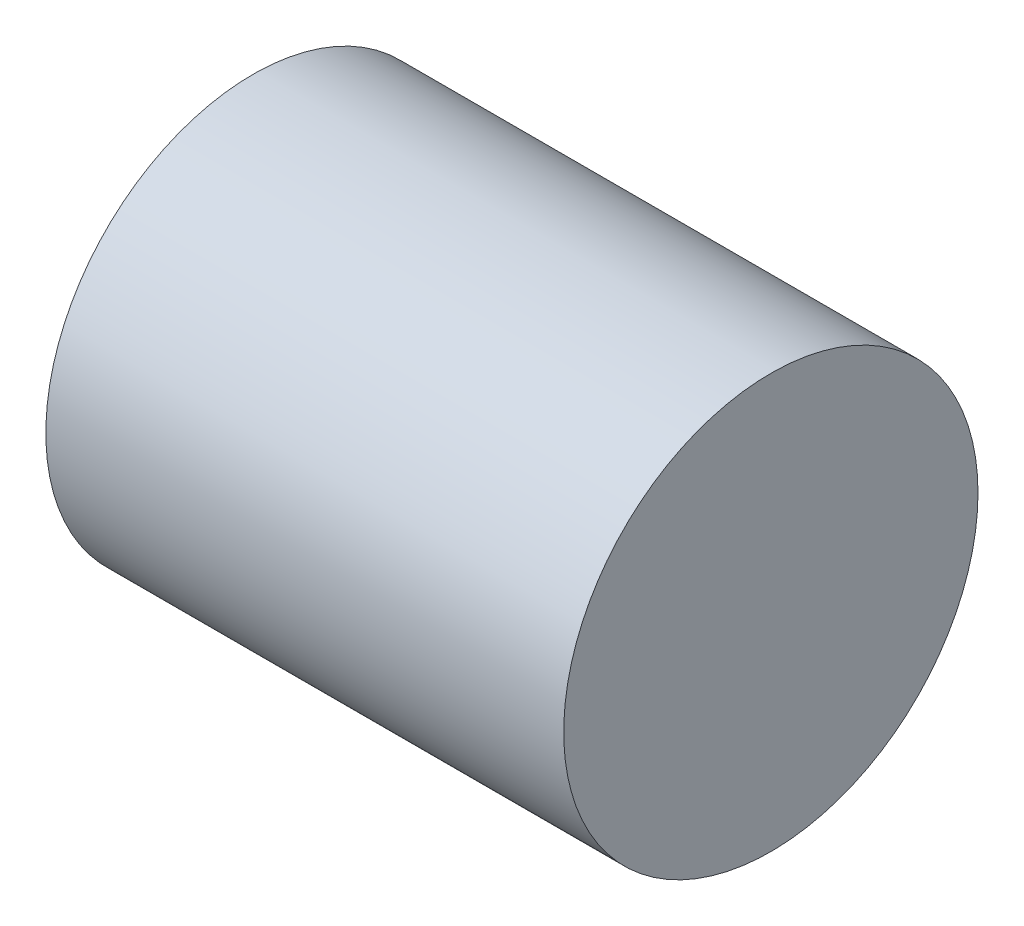
ISO-10303-21;
HEADER;
FILE_DESCRIPTION(('STEP AP214'),'2;1');
FILE_NAME('part.step','',(''),(''),'','','');
FILE_SCHEMA(('AUTOMOTIVE_DESIGN { 1 0 10303 214 1 1 1 1 }'));
ENDSEC;
DATA;
#1=APPLICATION_CONTEXT('core data for automotive mechanical design processes');
#2=APPLICATION_PROTOCOL_DEFINITION('international standard','automotive_design',2000,#1);
#3=PRODUCT_CONTEXT('',#1,'mechanical');
#4=PRODUCT('Part','Part','',(#3));
#5=PRODUCT_RELATED_PRODUCT_CATEGORY('part','',(#4));
#6=PRODUCT_DEFINITION_FORMATION('','',#4);
#7=PRODUCT_DEFINITION_CONTEXT('part definition',#1,'design');
#8=PRODUCT_DEFINITION('design','',#6,#7);
#9=PRODUCT_DEFINITION_SHAPE('','',#8);
#10=(LENGTH_UNIT() NAMED_UNIT(*) SI_UNIT(.MILLI.,.METRE.));
#11=(NAMED_UNIT(*) PLANE_ANGLE_UNIT() SI_UNIT($,.RADIAN.));
#12=(NAMED_UNIT(*) SI_UNIT($,.STERADIAN.) SOLID_ANGLE_UNIT());
#13=UNCERTAINTY_MEASURE_WITH_UNIT(LENGTH_MEASURE(1.E-05),#10,'distance_accuracy_value','');
#14=(GEOMETRIC_REPRESENTATION_CONTEXT(3) GLOBAL_UNCERTAINTY_ASSIGNED_CONTEXT((#13)) GLOBAL_UNIT_ASSIGNED_CONTEXT((#10,
#11,#12)) REPRESENTATION_CONTEXT('',''));
#15=CARTESIAN_POINT('',(0.,0.,0.));
#16=DIRECTION('',(0.,0.,1.));
#17=DIRECTION('',(1.,0.,0.));
#18=AXIS2_PLACEMENT_3D('',#15,#16,#17);
#19=CARTESIAN_POINT('',(10.,0.,0.));
#20=DIRECTION('',(-1.,0.,0.));
#21=DIRECTION('',(0.,0.,1.));
#22=AXIS2_PLACEMENT_3D('',#19,#20,#21);
#23=CYLINDRICAL_SURFACE('',#22,4.);
#24=CARTESIAN_POINT('',(10.,0.,0.));
#25=DIRECTION('',(1.,0.,0.));
#26=DIRECTION('',(0.,0.,-1.));
#27=AXIS2_PLACEMENT_3D('',#24,#25,#26);
#28=CIRCLE('',#27,4.);
#29=CARTESIAN_POINT('',(10.,0.,-4.));
#30=VERTEX_POINT('',#29);
#31=EDGE_CURVE('E10',#30,#30,#28,.T.);
#32=ORIENTED_EDGE('',*,*,#31,.F.);
#33=EDGE_LOOP('',(#32));
#34=FACE_BOUND('',#33,.T.);
#35=CARTESIAN_POINT('',(0.,0.,0.));
#36=DIRECTION('',(1.,0.,0.));
#37=DIRECTION('',(0.,0.,-1.));
#38=AXIS2_PLACEMENT_3D('',#35,#36,#37);
#39=CIRCLE('',#38,4.);
#40=CARTESIAN_POINT('',(0.,0.,-4.));
#41=VERTEX_POINT('',#40);
#42=EDGE_CURVE('E46',#41,#41,#39,.T.);
#43=ORIENTED_EDGE('',*,*,#42,.T.);
#44=EDGE_LOOP('',(#43));
#45=FACE_BOUND('',#44,.T.);
#46=ADVANCED_FACE('F43',(#34,#45),#23,.T.);
#47=CARTESIAN_POINT('',(10.,0.,0.));
#48=DIRECTION('',(1.,0.,0.));
#49=DIRECTION('',(0.,0.,-1.));
#50=AXIS2_PLACEMENT_3D('',#47,#48,#49);
#51=PLANE('',#50);
#52=ORIENTED_EDGE('',*,*,#31,.T.);
#53=EDGE_LOOP('',(#52));
#54=FACE_BOUND('',#53,.T.);
#55=ADVANCED_FACE('F76',(#54),#51,.T.);
#56=CARTESIAN_POINT('',(0.,0.,0.));
#57=DIRECTION('',(1.,0.,0.));
#58=DIRECTION('',(0.,0.,-1.));
#59=AXIS2_PLACEMENT_3D('',#56,#57,#58);
#60=PLANE('',#59);
#61=CARTESIAN_POINT('',(0.,0.,0.));
#62=DIRECTION('',(-1.,0.,0.));
#63=DIRECTION('',(0.,0.,1.));
#64=AXIS2_PLACEMENT_3D('',#61,#62,#63);
#65=CIRCLE('',#64,1.5);
#66=CARTESIAN_POINT('',(0.,0.,1.5));
#67=VERTEX_POINT('',#66);
#68=EDGE_CURVE('E57',#67,#67,#65,.T.);
#69=ORIENTED_EDGE('',*,*,#68,.F.);
#70=EDGE_LOOP('',(#69));
#71=FACE_BOUND('',#70,.T.);
#72=ORIENTED_EDGE('',*,*,#42,.F.);
#73=EDGE_LOOP('',(#72));
#74=FACE_BOUND('',#73,.T.);
#75=ADVANCED_FACE('F70',(#71,#74),#60,.F.);
#76=CARTESIAN_POINT('',(5.,0.,0.));
#77=DIRECTION('',(-1.,0.,0.));
#78=DIRECTION('',(0.,0.,1.));
#79=AXIS2_PLACEMENT_3D('',#76,#77,#78);
#80=CYLINDRICAL_SURFACE('',#79,1.5);
#81=CARTESIAN_POINT('',(5.,0.,0.));
#82=DIRECTION('',(-1.,0.,0.));
#83=DIRECTION('',(0.,0.,1.));
#84=AXIS2_PLACEMENT_3D('',#81,#82,#83);
#85=CIRCLE('',#84,1.5);
#86=CARTESIAN_POINT('',(5.,0.,1.5));
#87=VERTEX_POINT('',#86);
#88=EDGE_CURVE('E55',#87,#87,#85,.T.);
#89=ORIENTED_EDGE('',*,*,#88,.F.);
#90=EDGE_LOOP('',(#89));
#91=FACE_BOUND('',#90,.T.);
#92=ORIENTED_EDGE('',*,*,#68,.T.);
#93=EDGE_LOOP('',(#92));
#94=FACE_BOUND('',#93,.T.);
#95=ADVANCED_FACE('F67',(#91,#94),#80,.F.);
#96=CARTESIAN_POINT('',(5.,0.,0.));
#97=DIRECTION('',(-1.,0.,0.));
#98=DIRECTION('',(0.,0.,1.));
#99=AXIS2_PLACEMENT_3D('',#96,#97,#98);
#100=PLANE('',#99);
#101=ORIENTED_EDGE('',*,*,#88,.T.);
#102=EDGE_LOOP('',(#101));
#103=FACE_BOUND('',#102,.T.);
#104=ADVANCED_FACE('F65',(#103),#100,.T.);
#105=CLOSED_SHELL('',(#46,#55,#75,#95,#104));
#106=MANIFOLD_SOLID_BREP('B2',#105);
#107=ADVANCED_BREP_SHAPE_REPRESENTATION('',(#18,#106),#14);
#108=SHAPE_DEFINITION_REPRESENTATION(#9,#107);
ENDSEC;
END-ISO-10303-21;
